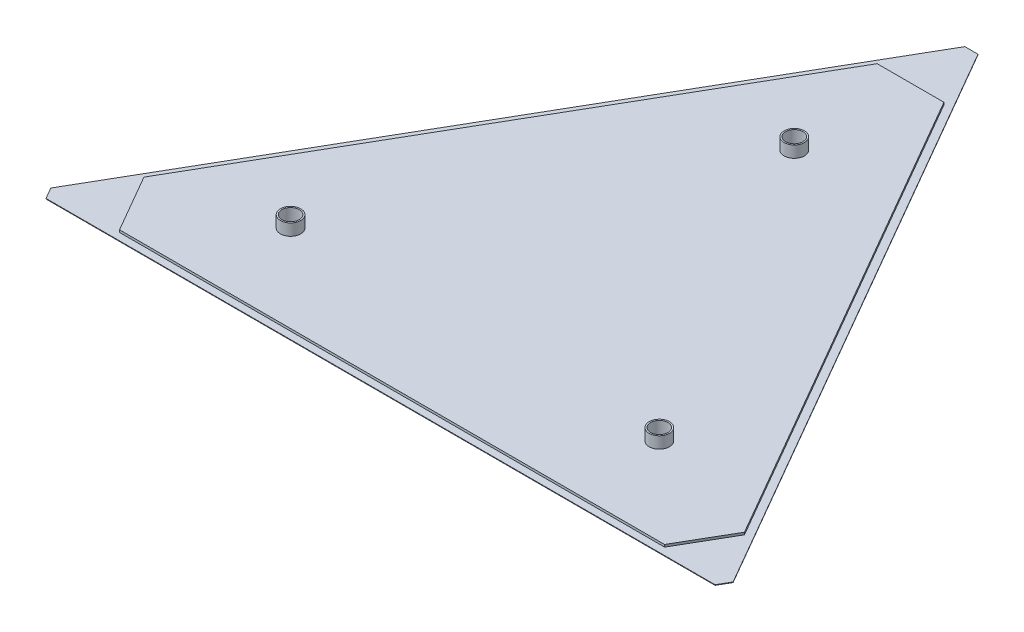
ISO-10303-21;
HEADER;
FILE_DESCRIPTION(('STEP AP214'),'2;1');
FILE_NAME('part.step','',(''),(''),'','','');
FILE_SCHEMA(('AUTOMOTIVE_DESIGN { 1 0 10303 214 1 1 1 1 }'));
ENDSEC;
DATA;
#1=APPLICATION_CONTEXT('core data for automotive mechanical design processes');
#2=APPLICATION_PROTOCOL_DEFINITION('international standard','automotive_design',2000,#1);
#3=PRODUCT_CONTEXT('',#1,'mechanical');
#4=PRODUCT('Part','Part','',(#3));
#5=PRODUCT_RELATED_PRODUCT_CATEGORY('part','',(#4));
#6=PRODUCT_DEFINITION_FORMATION('','',#4);
#7=PRODUCT_DEFINITION_CONTEXT('part definition',#1,'design');
#8=PRODUCT_DEFINITION('design','',#6,#7);
#9=PRODUCT_DEFINITION_SHAPE('','',#8);
#10=(LENGTH_UNIT() NAMED_UNIT(*) SI_UNIT(.MILLI.,.METRE.));
#11=(NAMED_UNIT(*) PLANE_ANGLE_UNIT() SI_UNIT($,.RADIAN.));
#12=(NAMED_UNIT(*) SI_UNIT($,.STERADIAN.) SOLID_ANGLE_UNIT());
#13=UNCERTAINTY_MEASURE_WITH_UNIT(LENGTH_MEASURE(1.E-05),#10,'distance_accuracy_value','');
#14=(GEOMETRIC_REPRESENTATION_CONTEXT(3) GLOBAL_UNCERTAINTY_ASSIGNED_CONTEXT((#13)) GLOBAL_UNIT_ASSIGNED_CONTEXT((#10,
#11,#12)) REPRESENTATION_CONTEXT('',''));
#15=CARTESIAN_POINT('',(0.,0.,0.));
#16=DIRECTION('',(0.,0.,1.));
#17=DIRECTION('',(1.,0.,0.));
#18=AXIS2_PLACEMENT_3D('',#15,#16,#17);
#19=CARTESIAN_POINT('',(283.758521159064,0.2,106.426112565137));
#20=DIRECTION('',(0.,1.,0.));
#21=DIRECTION('',(0.,0.,1.));
#22=AXIS2_PLACEMENT_3D('',#19,#20,#21);
#23=PLANE('',#22);
#24=CARTESIAN_POINT('',(283.758521159064,0.2,106.426112565137));
#25=DIRECTION('',(0.,1.,0.));
#26=DIRECTION('',(0.,0.,1.));
#27=AXIS2_PLACEMENT_3D('',#24,#25,#26);
#28=CIRCLE('',#27,2.99999999999999);
#29=CARTESIAN_POINT('',(283.758521159064,0.2,109.426112565137));
#30=VERTEX_POINT('',#29);
#31=EDGE_CURVE('E536',#30,#30,#28,.F.);
#32=ORIENTED_EDGE('',*,*,#31,.F.);
#33=EDGE_LOOP('',(#32));
#34=FACE_BOUND('',#33,.T.);
#35=CARTESIAN_POINT('',(283.758521159064,0.2,106.426112565137));
#36=DIRECTION('',(0.,1.,0.));
#37=DIRECTION('',(0.,0.,1.));
#38=AXIS2_PLACEMENT_3D('',#35,#36,#37);
#39=CIRCLE('',#38,1.50000000000002);
#40=CARTESIAN_POINT('',(283.758521159064,0.2,107.926112565137));
#41=VERTEX_POINT('',#40);
#42=EDGE_CURVE('E540',#41,#41,#39,.T.);
#43=ORIENTED_EDGE('',*,*,#42,.F.);
#44=EDGE_LOOP('',(#43));
#45=FACE_BOUND('',#44,.T.);
#46=ADVANCED_FACE('F340',(#34,#45),#23,.T.);
#47=CARTESIAN_POINT('',(283.758521159064,0.,106.426112565137));
#48=DIRECTION('',(0.,1.,0.));
#49=DIRECTION('',(0.,0.,1.));
#50=AXIS2_PLACEMENT_3D('',#47,#48,#49);
#51=PLANE('',#50);
#52=CARTESIAN_POINT('',(283.758521159064,0.,106.426112565137));
#53=DIRECTION('',(0.,1.,0.));
#54=DIRECTION('',(0.,0.,1.));
#55=AXIS2_PLACEMENT_3D('',#52,#53,#54);
#56=CIRCLE('',#55,1.50000000000002);
#57=CARTESIAN_POINT('',(283.758521159064,0.,107.926112565137));
#58=VERTEX_POINT('',#57);
#59=EDGE_CURVE('E539',#58,#58,#56,.T.);
#60=ORIENTED_EDGE('',*,*,#59,.T.);
#61=EDGE_LOOP('',(#60));
#62=FACE_BOUND('',#61,.T.);
#63=DIRECTION('',(-0.500006074239499,0.,0.866021896792226));
#64=VECTOR('',#63,1.);
#65=CARTESIAN_POINT('',(464.784783451273,0.,134.98666154419));
#66=LINE('',#65,#64);
#67=CARTESIAN_POINT('',(464.784783451273,0.,134.98666154419));
#68=VERTEX_POINT('',#67);
#69=CARTESIAN_POINT('',(462.517056766971,0.,138.914415757042));
#70=VERTEX_POINT('',#69);
#71=EDGE_CURVE('E503',#68,#70,#66,.T.);
#72=ORIENTED_EDGE('',*,*,#71,.T.);
#73=DIRECTION('',(-1.,0.,0.));
#74=VECTOR('',#73,1.);
#75=CARTESIAN_POINT('',(462.517056766971,0.,138.914415757042));
#76=LINE('',#75,#74);
#77=CARTESIAN_POINT('',(231.98117121446,0.,138.914415757042));
#78=VERTEX_POINT('',#77);
#79=EDGE_CURVE('E500',#70,#78,#76,.T.);
#80=ORIENTED_EDGE('',*,*,#79,.T.);
#81=DIRECTION('',(-0.500096078867163,0.,-0.865969925518022));
#82=VECTOR('',#81,1.);
#83=CARTESIAN_POINT('',(231.98117121446,0.,138.914415757042));
#84=LINE('',#83,#82);
#85=CARTESIAN_POINT('',(229.712705006684,0.,134.986323544367));
#86=VERTEX_POINT('',#85);
#87=EDGE_CURVE('E497',#78,#86,#84,.T.);
#88=ORIENTED_EDGE('',*,*,#87,.T.);
#89=DIRECTION('',(-0.500000615401474,0.,0.86602504848194));
#90=VECTOR('',#89,1.);
#91=CARTESIAN_POINT('',(344.980692968777,0.,-64.6633604527868));
#92=LINE('',#91,#90);
#93=CARTESIAN_POINT('',(344.980692968777,0.,-64.6633604527868));
#94=VERTEX_POINT('',#93);
#95=EDGE_CURVE('E494',#94,#86,#92,.T.);
#96=ORIENTED_EDGE('',*,*,#95,.F.);
#97=DIRECTION('',(-1.,0.,0.));
#98=VECTOR('',#97,1.);
#99=CARTESIAN_POINT('',(349.516789507603,0.,-64.6633604527868));
#100=LINE('',#99,#98);
#101=CARTESIAN_POINT('',(349.516789507603,0.,-64.6633604527868));
#102=VERTEX_POINT('',#101);
#103=EDGE_CURVE('E491',#102,#94,#100,.T.);
#104=ORIENTED_EDGE('',*,*,#103,.F.);
#105=DIRECTION('',(-0.500000000000002,0.,-0.866025403784437));
#106=VECTOR('',#105,1.);
#107=CARTESIAN_POINT('',(464.784783451273,0.,134.98666154419));
#108=LINE('',#107,#106);
#109=EDGE_CURVE('E489',#68,#102,#108,.T.);
#110=ORIENTED_EDGE('',*,*,#109,.F.);
#111=EDGE_LOOP('',(#72,#80,#88,#96,#104,#110));
#112=FACE_BOUND('',#111,.T.);
#113=CARTESIAN_POINT('',(410.793152562545,0.,106.417182486529));
#114=DIRECTION('',(0.,1.,0.));
#115=DIRECTION('',(0.,0.,1.));
#116=AXIS2_PLACEMENT_3D('',#113,#114,#115);
#117=CIRCLE('',#116,1.50000000000002);
#118=CARTESIAN_POINT('',(410.793152562545,0.,107.917182486529));
#119=VERTEX_POINT('',#118);
#120=EDGE_CURVE('E560',#119,#119,#117,.T.);
#121=ORIENTED_EDGE('',*,*,#120,.T.);
#122=EDGE_LOOP('',(#121));
#123=FACE_BOUND('',#122,.T.);
#124=CARTESIAN_POINT('',(347.27360972876,0.,-3.60923082455256));
#125=DIRECTION('',(0.,1.,0.));
#126=DIRECTION('',(0.,0.,1.));
#127=AXIS2_PLACEMENT_3D('',#124,#125,#126);
#128=CIRCLE('',#127,1.50000000000002);
#129=CARTESIAN_POINT('',(347.27360972876,0.,-2.10923082455254));
#130=VERTEX_POINT('',#129);
#131=EDGE_CURVE('E901',#130,#130,#128,.T.);
#132=ORIENTED_EDGE('',*,*,#131,.T.);
#133=EDGE_LOOP('',(#132));
#134=FACE_BOUND('',#133,.T.);
#135=ADVANCED_FACE('F342',(#62,#112,#123,#134),#51,.F.);
#136=CARTESIAN_POINT('',(283.758521159064,0.2,106.426112565137));
#137=DIRECTION('',(0.,-1.,0.));
#138=DIRECTION('',(0.,0.,-1.));
#139=AXIS2_PLACEMENT_3D('',#136,#137,#138);
#140=CYLINDRICAL_SURFACE('',#139,1.50000000000002);
#141=ORIENTED_EDGE('',*,*,#42,.T.);
#142=EDGE_LOOP('',(#141));
#143=FACE_BOUND('',#142,.T.);
#144=ORIENTED_EDGE('',*,*,#59,.F.);
#145=EDGE_LOOP('',(#144));
#146=FACE_BOUND('',#145,.T.);
#147=ADVANCED_FACE('F598',(#143,#146),#140,.F.);
#148=CARTESIAN_POINT('',(283.758521159064,5.,106.426112565137));
#149=DIRECTION('',(0.,-1.,0.));
#150=DIRECTION('',(0.,0.,-1.));
#151=AXIS2_PLACEMENT_3D('',#148,#149,#150);
#152=CYLINDRICAL_SURFACE('',#151,2.99999999999999);
#153=ORIENTED_EDGE('',*,*,#31,.T.);
#154=EDGE_LOOP('',(#153));
#155=FACE_BOUND('',#154,.T.);
#156=CARTESIAN_POINT('',(283.758521159064,5.,106.426112565137));
#157=DIRECTION('',(0.,1.,0.));
#158=DIRECTION('',(0.,0.,1.));
#159=AXIS2_PLACEMENT_3D('',#156,#157,#158);
#160=CIRCLE('',#159,2.99999999999999);
#161=CARTESIAN_POINT('',(283.758521159064,5.,109.426112565137));
#162=VERTEX_POINT('',#161);
#163=EDGE_CURVE('E530',#162,#162,#160,.T.);
#164=ORIENTED_EDGE('',*,*,#163,.T.);
#165=EDGE_LOOP('',(#164));
#166=FACE_BOUND('',#165,.T.);
#167=ADVANCED_FACE('F605',(#155,#166),#152,.F.);
#168=CARTESIAN_POINT('',(283.758521159064,5.,106.426112565137));
#169=DIRECTION('',(0.,-1.,0.));
#170=DIRECTION('',(0.,0.,-1.));
#171=AXIS2_PLACEMENT_3D('',#168,#169,#170);
#172=CYLINDRICAL_SURFACE('',#171,3.50000000000002);
#173=CARTESIAN_POINT('',(283.758521159064,1.,106.426112565137));
#174=DIRECTION('',(0.,1.,0.));
#175=DIRECTION('',(0.,0.,1.));
#176=AXIS2_PLACEMENT_3D('',#173,#174,#175);
#177=CIRCLE('',#176,3.50000000000002);
#178=CARTESIAN_POINT('',(283.758521159064,1.,109.926112565137));
#179=VERTEX_POINT('',#178);
#180=EDGE_CURVE('E563',#179,#179,#177,.T.);
#181=ORIENTED_EDGE('',*,*,#180,.T.);
#182=EDGE_LOOP('',(#181));
#183=FACE_BOUND('',#182,.T.);
#184=CARTESIAN_POINT('',(283.758521159064,5.,106.426112565137));
#185=DIRECTION('',(0.,1.,0.));
#186=DIRECTION('',(0.,0.,1.));
#187=AXIS2_PLACEMENT_3D('',#184,#185,#186);
#188=CIRCLE('',#187,3.50000000000002);
#189=CARTESIAN_POINT('',(283.758521159064,5.,109.926112565137));
#190=VERTEX_POINT('',#189);
#191=EDGE_CURVE('E533',#190,#190,#188,.T.);
#192=ORIENTED_EDGE('',*,*,#191,.F.);
#193=EDGE_LOOP('',(#192));
#194=FACE_BOUND('',#193,.T.);
#195=ADVANCED_FACE('F609',(#183,#194),#172,.T.);
#196=CARTESIAN_POINT('',(0.,5.,0.));
#197=DIRECTION('',(0.,1.,0.));
#198=DIRECTION('',(0.,0.,1.));
#199=AXIS2_PLACEMENT_3D('',#196,#197,#198);
#200=PLANE('',#199);
#201=ORIENTED_EDGE('',*,*,#163,.F.);
#202=EDGE_LOOP('',(#201));
#203=FACE_BOUND('',#202,.T.);
#204=ORIENTED_EDGE('',*,*,#191,.T.);
#205=EDGE_LOOP('',(#204));
#206=FACE_BOUND('',#205,.T.);
#207=ADVANCED_FACE('F613',(#203,#206),#200,.T.);
#208=CARTESIAN_POINT('',(0.,0.2,0.));
#209=DIRECTION('',(0.,-1.,0.));
#210=DIRECTION('',(0.,0.,-1.));
#211=AXIS2_PLACEMENT_3D('',#208,#209,#210);
#212=PLANE('',#211);
#213=DIRECTION('',(-0.500006074239499,0.,0.866021896792226));
#214=VECTOR('',#213,1.);
#215=CARTESIAN_POINT('',(464.784783451273,0.2,134.98666154419));
#216=LINE('',#215,#214);
#217=CARTESIAN_POINT('',(464.784783451273,0.2,134.98666154419));
#218=VERTEX_POINT('',#217);
#219=CARTESIAN_POINT('',(462.517056766971,0.2,138.914415757042));
#220=VERTEX_POINT('',#219);
#221=EDGE_CURVE('E492',#218,#220,#216,.T.);
#222=ORIENTED_EDGE('',*,*,#221,.F.);
#223=DIRECTION('',(-0.500000000000002,0.,-0.866025403784437));
#224=VECTOR('',#223,1.);
#225=CARTESIAN_POINT('',(464.784783451273,0.2,134.98666154419));
#226=LINE('',#225,#224);
#227=CARTESIAN_POINT('',(349.516789507603,0.2,-64.6633604527868));
#228=VERTEX_POINT('',#227);
#229=EDGE_CURVE('E477',#218,#228,#226,.T.);
#230=ORIENTED_EDGE('',*,*,#229,.T.);
#231=DIRECTION('',(-1.,0.,0.));
#232=VECTOR('',#231,1.);
#233=CARTESIAN_POINT('',(349.516789507603,0.2,-64.6633604527868));
#234=LINE('',#233,#232);
#235=CARTESIAN_POINT('',(344.980692968777,0.2,-64.6633604527868));
#236=VERTEX_POINT('',#235);
#237=EDGE_CURVE('E508',#228,#236,#234,.T.);
#238=ORIENTED_EDGE('',*,*,#237,.T.);
#239=DIRECTION('',(-0.500000615401474,0.,0.86602504848194));
#240=VECTOR('',#239,1.);
#241=CARTESIAN_POINT('',(344.980692968777,0.2,-64.6633604527868));
#242=LINE('',#241,#240);
#243=CARTESIAN_POINT('',(229.712705006684,0.2,134.986323544367));
#244=VERTEX_POINT('',#243);
#245=EDGE_CURVE('E510',#236,#244,#242,.T.);
#246=ORIENTED_EDGE('',*,*,#245,.T.);
#247=DIRECTION('',(-0.500096078867163,0.,-0.865969925518022));
#248=VECTOR('',#247,1.);
#249=CARTESIAN_POINT('',(231.98117121446,0.2,138.914415757042));
#250=LINE('',#249,#248);
#251=CARTESIAN_POINT('',(231.98117121446,0.2,138.914415757042));
#252=VERTEX_POINT('',#251);
#253=EDGE_CURVE('E512',#252,#244,#250,.T.);
#254=ORIENTED_EDGE('',*,*,#253,.F.);
#255=DIRECTION('',(-1.,0.,0.));
#256=VECTOR('',#255,1.);
#257=CARTESIAN_POINT('',(462.517056766971,0.2,138.914415757042));
#258=LINE('',#257,#256);
#259=EDGE_CURVE('E515',#220,#252,#258,.T.);
#260=ORIENTED_EDGE('',*,*,#259,.F.);
#261=EDGE_LOOP('',(#222,#230,#238,#246,#254,#260));
#262=FACE_BOUND('',#261,.T.);
#263=DIRECTION('',(-0.500000615401474,0.,0.86602504848194));
#264=VECTOR('',#263,1.);
#265=CARTESIAN_POINT('',(335.767496284372,0.2,-43.6660380660085));
#266=LINE('',#265,#264);
#267=CARTESIAN_POINT('',(335.767496284372,0.2,-43.6660380660085));
#268=VERTEX_POINT('',#267);
#269=CARTESIAN_POINT('',(243.304219773312,0.2,116.484791866457));
#270=VERTEX_POINT('',#269);
#271=EDGE_CURVE('E528',#268,#270,#266,.T.);
#272=ORIENTED_EDGE('',*,*,#271,.F.);
#273=DIRECTION('',(-1.,0.,0.));
#274=VECTOR('',#273,1.);
#275=CARTESIAN_POINT('',(358.778179034986,0.2,-43.6660380660085));
#276=LINE('',#275,#274);
#277=CARTESIAN_POINT('',(358.778179034986,0.2,-43.6660380660085));
#278=VERTEX_POINT('',#277);
#279=EDGE_CURVE('E506',#278,#268,#276,.T.);
#280=ORIENTED_EDGE('',*,*,#279,.F.);
#281=DIRECTION('',(-0.500061082747631,0.,-0.86599013477133));
#282=VECTOR('',#281,1.);
#283=CARTESIAN_POINT('',(452.699916625105,0.2,118.984688014734));
#284=LINE('',#283,#282);
#285=CARTESIAN_POINT('',(452.699916625105,0.2,118.984688014734));
#286=VERTEX_POINT('',#285);
#287=EDGE_CURVE('E522',#286,#278,#284,.T.);
#288=ORIENTED_EDGE('',*,*,#287,.F.);
#289=DIRECTION('',(-0.501404010499261,0.,0.865213279056244));
#290=VECTOR('',#289,1.);
#291=CARTESIAN_POINT('',(452.699916625105,0.2,118.984688014734));
#292=LINE('',#291,#290);
#293=CARTESIAN_POINT('',(442.602090749265,0.2,136.40930539798));
#294=VERTEX_POINT('',#293);
#295=EDGE_CURVE('E361',#286,#294,#292,.T.);
#296=ORIENTED_EDGE('',*,*,#295,.T.);
#297=DIRECTION('',(-0.999999999997625,0.,-2.17931289567932E-06));
#298=VECTOR('',#297,1.);
#299=CARTESIAN_POINT('',(442.602090749265,0.2,136.40930539798));
#300=LINE('',#299,#298);
#301=CARTESIAN_POINT('',(254.809280576088,0.2,136.408896138687));
#302=VERTEX_POINT('',#301);
#303=EDGE_CURVE('E433',#294,#302,#300,.T.);
#304=ORIENTED_EDGE('',*,*,#303,.T.);
#305=DIRECTION('',(0.500061082747631,0.,0.86599013477133));
#306=VECTOR('',#305,1.);
#307=CARTESIAN_POINT('',(243.304219773312,0.2,116.484791866457));
#308=LINE('',#307,#306);
#309=EDGE_CURVE('E355',#270,#302,#308,.T.);
#310=ORIENTED_EDGE('',*,*,#309,.F.);
#311=EDGE_LOOP('',(#272,#280,#288,#296,#304,#310));
#312=FACE_BOUND('',#311,.T.);
#313=ADVANCED_FACE('F617',(#262,#312),#212,.F.);
#314=CARTESIAN_POINT('',(464.784783451273,0.2,134.98666154419));
#315=DIRECTION('',(0.866021896792226,0.,0.500006074239499));
#316=DIRECTION('',(0.500006074239499,0.,-0.866021896792226));
#317=AXIS2_PLACEMENT_3D('',#314,#315,#316);
#318=PLANE('',#317);
#319=ORIENTED_EDGE('',*,*,#71,.F.);
#320=DIRECTION('',(0.,-1.,0.));
#321=VECTOR('',#320,1.);
#322=CARTESIAN_POINT('',(464.784783451273,0.2,134.98666154419));
#323=LINE('',#322,#321);
#324=EDGE_CURVE('E436',#218,#68,#323,.T.);
#325=ORIENTED_EDGE('',*,*,#324,.F.);
#326=ORIENTED_EDGE('',*,*,#221,.T.);
#327=DIRECTION('',(0.,-1.,0.));
#328=VECTOR('',#327,1.);
#329=CARTESIAN_POINT('',(462.517056766971,0.2,138.914415757042));
#330=LINE('',#329,#328);
#331=EDGE_CURVE('E475',#220,#70,#330,.T.);
#332=ORIENTED_EDGE('',*,*,#331,.T.);
#333=EDGE_LOOP('',(#319,#325,#326,#332));
#334=FACE_BOUND('',#333,.T.);
#335=ADVANCED_FACE('F621',(#334),#318,.T.);
#336=CARTESIAN_POINT('',(464.784783451273,0.2,134.98666154419));
#337=DIRECTION('',(-0.866025403784438,0.,0.500000000000002));
#338=DIRECTION('',(0.500000000000002,0.,0.866025403784438));
#339=AXIS2_PLACEMENT_3D('',#336,#337,#338);
#340=PLANE('',#339);
#341=ORIENTED_EDGE('',*,*,#109,.T.);
#342=DIRECTION('',(0.,-1.,0.));
#343=VECTOR('',#342,1.);
#344=CARTESIAN_POINT('',(349.516789507603,0.2,-64.6633604527868));
#345=LINE('',#344,#343);
#346=EDGE_CURVE('E485',#228,#102,#345,.T.);
#347=ORIENTED_EDGE('',*,*,#346,.F.);
#348=ORIENTED_EDGE('',*,*,#229,.F.);
#349=ORIENTED_EDGE('',*,*,#324,.T.);
#350=EDGE_LOOP('',(#341,#347,#348,#349));
#351=FACE_BOUND('',#350,.T.);
#352=ADVANCED_FACE('F623',(#351),#340,.F.);
#353=CARTESIAN_POINT('',(349.516789507603,0.2,-64.6633604527868));
#354=DIRECTION('',(0.,0.,1.));
#355=DIRECTION('',(1.,0.,0.));
#356=AXIS2_PLACEMENT_3D('',#353,#354,#355);
#357=PLANE('',#356);
#358=ORIENTED_EDGE('',*,*,#103,.T.);
#359=DIRECTION('',(0.,-1.,0.));
#360=VECTOR('',#359,1.);
#361=CARTESIAN_POINT('',(344.980692968777,0.2,-64.6633604527868));
#362=LINE('',#361,#360);
#363=EDGE_CURVE('E482',#236,#94,#362,.T.);
#364=ORIENTED_EDGE('',*,*,#363,.F.);
#365=ORIENTED_EDGE('',*,*,#237,.F.);
#366=ORIENTED_EDGE('',*,*,#346,.T.);
#367=EDGE_LOOP('',(#358,#364,#365,#366));
#368=FACE_BOUND('',#367,.T.);
#369=ADVANCED_FACE('F626',(#368),#357,.F.);
#370=CARTESIAN_POINT('',(344.980692968777,0.2,-64.6633604527868));
#371=DIRECTION('',(0.866025048481941,0.,0.500000615401474));
#372=DIRECTION('',(0.500000615401474,0.,-0.866025048481941));
#373=AXIS2_PLACEMENT_3D('',#370,#371,#372);
#374=PLANE('',#373);
#375=ORIENTED_EDGE('',*,*,#95,.T.);
#376=DIRECTION('',(0.,-1.,0.));
#377=VECTOR('',#376,1.);
#378=CARTESIAN_POINT('',(229.712705006684,0.2,134.986323544367));
#379=LINE('',#378,#377);
#380=EDGE_CURVE('E480',#244,#86,#379,.T.);
#381=ORIENTED_EDGE('',*,*,#380,.F.);
#382=ORIENTED_EDGE('',*,*,#245,.F.);
#383=ORIENTED_EDGE('',*,*,#363,.T.);
#384=EDGE_LOOP('',(#375,#381,#382,#383));
#385=FACE_BOUND('',#384,.T.);
#386=ADVANCED_FACE('F630',(#385),#374,.F.);
#387=CARTESIAN_POINT('',(231.98117121446,0.2,138.914415757042));
#388=DIRECTION('',(-0.865969925518022,0.,0.500096078867163));
#389=DIRECTION('',(0.500096078867163,0.,0.865969925518022));
#390=AXIS2_PLACEMENT_3D('',#387,#388,#389);
#391=PLANE('',#390);
#392=ORIENTED_EDGE('',*,*,#87,.F.);
#393=DIRECTION('',(0.,-1.,0.));
#394=VECTOR('',#393,1.);
#395=CARTESIAN_POINT('',(231.98117121446,0.2,138.914415757042));
#396=LINE('',#395,#394);
#397=EDGE_CURVE('E478',#252,#78,#396,.T.);
#398=ORIENTED_EDGE('',*,*,#397,.F.);
#399=ORIENTED_EDGE('',*,*,#253,.T.);
#400=ORIENTED_EDGE('',*,*,#380,.T.);
#401=EDGE_LOOP('',(#392,#398,#399,#400));
#402=FACE_BOUND('',#401,.T.);
#403=ADVANCED_FACE('F634',(#402),#391,.T.);
#404=CARTESIAN_POINT('',(462.517056766971,0.2,138.914415757042));
#405=DIRECTION('',(0.,0.,1.));
#406=DIRECTION('',(1.,0.,0.));
#407=AXIS2_PLACEMENT_3D('',#404,#405,#406);
#408=PLANE('',#407);
#409=ORIENTED_EDGE('',*,*,#79,.F.);
#410=ORIENTED_EDGE('',*,*,#331,.F.);
#411=ORIENTED_EDGE('',*,*,#259,.T.);
#412=ORIENTED_EDGE('',*,*,#397,.T.);
#413=EDGE_LOOP('',(#409,#410,#411,#412));
#414=FACE_BOUND('',#413,.T.);
#415=ADVANCED_FACE('F638',(#414),#408,.T.);
#416=CARTESIAN_POINT('',(132.019800225658,1.,-76.2340835007328));
#417=DIRECTION('',(0.86599013477133,0.,-0.500061082747631));
#418=DIRECTION('',(-0.500061082747631,0.,-0.86599013477133));
#419=AXIS2_PLACEMENT_3D('',#416,#417,#418);
#420=PLANE('',#419);
#421=DIRECTION('',(0.,-1.,0.));
#422=VECTOR('',#421,1.);
#423=CARTESIAN_POINT('',(243.304219773312,1.,116.484791866457));
#424=LINE('',#423,#422);
#425=CARTESIAN_POINT('',(243.304219773312,1.,116.484791866457));
#426=VERTEX_POINT('',#425);
#427=EDGE_CURVE('E465',#426,#270,#424,.T.);
#428=ORIENTED_EDGE('',*,*,#427,.T.);
#429=ORIENTED_EDGE('',*,*,#309,.T.);
#430=DIRECTION('',(0.,-1.,0.));
#431=VECTOR('',#430,1.);
#432=CARTESIAN_POINT('',(254.809280576088,1.,136.408896138687));
#433=LINE('',#432,#431);
#434=CARTESIAN_POINT('',(254.809280576088,1.,136.408896138687));
#435=VERTEX_POINT('',#434);
#436=EDGE_CURVE('E463',#435,#302,#433,.T.);
#437=ORIENTED_EDGE('',*,*,#436,.F.);
#438=DIRECTION('',(0.500061082747631,0.,0.86599013477133));
#439=VECTOR('',#438,1.);
#440=CARTESIAN_POINT('',(132.019800225658,1.,-76.2340835007328));
#441=LINE('',#440,#439);
#442=EDGE_CURVE('E445',#426,#435,#441,.T.);
#443=ORIENTED_EDGE('',*,*,#442,.F.);
#444=EDGE_LOOP('',(#428,#429,#437,#443));
#445=FACE_BOUND('',#444,.T.);
#446=ADVANCED_FACE('F642',(#445),#420,.F.);
#447=CARTESIAN_POINT('',(-0.000297276456247321,1.,136.408340828888));
#448=DIRECTION('',(-2.17931289567932E-06,0.,0.999999999997625));
#449=DIRECTION('',(0.999999999997625,0.,2.17931289567932E-06));
#450=AXIS2_PLACEMENT_3D('',#447,#448,#449);
#451=PLANE('',#450);
#452=ORIENTED_EDGE('',*,*,#303,.F.);
#453=DIRECTION('',(0.,-1.,0.));
#454=VECTOR('',#453,1.);
#455=CARTESIAN_POINT('',(442.602090749265,1.,136.40930539798));
#456=LINE('',#455,#454);
#457=CARTESIAN_POINT('',(442.602090749265,1.,136.40930539798));
#458=VERTEX_POINT('',#457);
#459=EDGE_CURVE('E428',#458,#294,#456,.T.);
#460=ORIENTED_EDGE('',*,*,#459,.F.);
#461=DIRECTION('',(-0.999999999997625,0.,-2.17931289567932E-06));
#462=VECTOR('',#461,1.);
#463=CARTESIAN_POINT('',(-0.000297276456247321,1.,136.408340828888));
#464=LINE('',#463,#462);
#465=EDGE_CURVE('E432',#458,#435,#464,.T.);
#466=ORIENTED_EDGE('',*,*,#465,.T.);
#467=ORIENTED_EDGE('',*,*,#436,.T.);
#468=EDGE_LOOP('',(#452,#460,#466,#467));
#469=FACE_BOUND('',#468,.T.);
#470=ADVANCED_FACE('F430',(#469),#451,.T.);
#471=CARTESIAN_POINT('',(390.506554541865,1.,226.30437756008));
#472=DIRECTION('',(0.865213279056244,0.,0.501404010499261));
#473=DIRECTION('',(0.501404010499261,0.,-0.865213279056244));
#474=AXIS2_PLACEMENT_3D('',#471,#472,#473);
#475=PLANE('',#474);
#476=ORIENTED_EDGE('',*,*,#295,.F.);
#477=DIRECTION('',(0.,-1.,0.));
#478=VECTOR('',#477,1.);
#479=CARTESIAN_POINT('',(452.699916625105,1.,118.984688014734));
#480=LINE('',#479,#478);
#481=CARTESIAN_POINT('',(452.699916625105,1.,118.984688014734));
#482=VERTEX_POINT('',#481);
#483=EDGE_CURVE('E437',#482,#286,#480,.T.);
#484=ORIENTED_EDGE('',*,*,#483,.F.);
#485=DIRECTION('',(-0.501404010499261,0.,0.865213279056244));
#486=VECTOR('',#485,1.);
#487=CARTESIAN_POINT('',(390.506554541865,1.,226.30437756008));
#488=LINE('',#487,#486);
#489=EDGE_CURVE('E443',#482,#458,#488,.T.);
#490=ORIENTED_EDGE('',*,*,#489,.T.);
#491=ORIENTED_EDGE('',*,*,#459,.T.);
#492=EDGE_LOOP('',(#476,#484,#490,#491));
#493=FACE_BOUND('',#492,.T.);
#494=ADVANCED_FACE('F449',(#493),#475,.T.);
#495=CARTESIAN_POINT('',(0.,1.,-43.6660380660085));
#496=DIRECTION('',(0.,0.,1.));
#497=DIRECTION('',(1.,0.,0.));
#498=AXIS2_PLACEMENT_3D('',#495,#496,#497);
#499=PLANE('',#498);
#500=DIRECTION('',(0.,-1.,0.));
#501=VECTOR('',#500,1.);
#502=CARTESIAN_POINT('',(358.778179034986,1.,-43.6660380660085));
#503=LINE('',#502,#501);
#504=CARTESIAN_POINT('',(358.778179034986,1.,-43.6660380660085));
#505=VERTEX_POINT('',#504);
#506=EDGE_CURVE('E471',#505,#278,#503,.T.);
#507=ORIENTED_EDGE('',*,*,#506,.T.);
#508=ORIENTED_EDGE('',*,*,#279,.T.);
#509=DIRECTION('',(0.,-1.,0.));
#510=VECTOR('',#509,1.);
#511=CARTESIAN_POINT('',(335.767496284372,1.,-43.6660380660085));
#512=LINE('',#511,#510);
#513=CARTESIAN_POINT('',(335.767496284372,1.,-43.6660380660085));
#514=VERTEX_POINT('',#513);
#515=EDGE_CURVE('E468',#514,#268,#512,.T.);
#516=ORIENTED_EDGE('',*,*,#515,.F.);
#517=DIRECTION('',(-1.,0.,0.));
#518=VECTOR('',#517,1.);
#519=CARTESIAN_POINT('',(0.,1.,-43.6660380660085));
#520=LINE('',#519,#518);
#521=EDGE_CURVE('E454',#505,#514,#520,.T.);
#522=ORIENTED_EDGE('',*,*,#521,.F.);
#523=EDGE_LOOP('',(#507,#508,#516,#522));
#524=FACE_BOUND('',#523,.T.);
#525=ADVANCED_FACE('F651',(#524),#499,.F.);
#526=CARTESIAN_POINT('',(287.97120668039,1.,-166.287337038502));
#527=DIRECTION('',(-0.86599013477133,0.,0.500061082747631));
#528=DIRECTION('',(0.500061082747631,0.,0.86599013477133));
#529=AXIS2_PLACEMENT_3D('',#526,#527,#528);
#530=PLANE('',#529);
#531=ORIENTED_EDGE('',*,*,#483,.T.);
#532=ORIENTED_EDGE('',*,*,#287,.T.);
#533=ORIENTED_EDGE('',*,*,#506,.F.);
#534=DIRECTION('',(-0.500061082747631,0.,-0.86599013477133));
#535=VECTOR('',#534,1.);
#536=CARTESIAN_POINT('',(287.97120668039,1.,-166.287337038502));
#537=LINE('',#536,#535);
#538=EDGE_CURVE('E452',#482,#505,#537,.T.);
#539=ORIENTED_EDGE('',*,*,#538,.F.);
#540=EDGE_LOOP('',(#531,#532,#533,#539));
#541=FACE_BOUND('',#540,.T.);
#542=ADVANCED_FACE('F587',(#541),#530,.F.);
#543=CARTESIAN_POINT('',(232.917450942825,1.,134.475173683829));
#544=DIRECTION('',(0.866025048481941,0.,0.500000615401474));
#545=DIRECTION('',(0.500000615401474,0.,-0.866025048481941));
#546=AXIS2_PLACEMENT_3D('',#543,#544,#545);
#547=PLANE('',#546);
#548=ORIENTED_EDGE('',*,*,#515,.T.);
#549=ORIENTED_EDGE('',*,*,#271,.T.);
#550=ORIENTED_EDGE('',*,*,#427,.F.);
#551=DIRECTION('',(-0.500000615401474,0.,0.866025048481941));
#552=VECTOR('',#551,1.);
#553=CARTESIAN_POINT('',(232.917450942825,1.,134.475173683829));
#554=LINE('',#553,#552);
#555=EDGE_CURVE('E460',#514,#426,#554,.T.);
#556=ORIENTED_EDGE('',*,*,#555,.F.);
#557=EDGE_LOOP('',(#548,#549,#550,#556));
#558=FACE_BOUND('',#557,.T.);
#559=ADVANCED_FACE('F581',(#558),#547,.F.);
#560=CARTESIAN_POINT('',(0.,1.,0.));
#561=DIRECTION('',(0.,1.,0.));
#562=DIRECTION('',(0.,0.,1.));
#563=AXIS2_PLACEMENT_3D('',#560,#561,#562);
#564=PLANE('',#563);
#565=ORIENTED_EDGE('',*,*,#180,.F.);
#566=EDGE_LOOP('',(#565));
#567=FACE_BOUND('',#566,.T.);
#568=CARTESIAN_POINT('',(410.793152562545,1.,106.417182486529));
#569=DIRECTION('',(0.,1.,0.));
#570=DIRECTION('',(0.,0.,1.));
#571=AXIS2_PLACEMENT_3D('',#568,#569,#570);
#572=CIRCLE('',#571,3.50000000000002);
#573=CARTESIAN_POINT('',(410.793152562545,1.,109.917182486529));
#574=VERTEX_POINT('',#573);
#575=EDGE_CURVE('E572',#574,#574,#572,.T.);
#576=ORIENTED_EDGE('',*,*,#575,.F.);
#577=EDGE_LOOP('',(#576));
#578=FACE_BOUND('',#577,.T.);
#579=CARTESIAN_POINT('',(347.27360972876,1.,-3.60923082455256));
#580=DIRECTION('',(0.,1.,0.));
#581=DIRECTION('',(0.,0.,1.));
#582=AXIS2_PLACEMENT_3D('',#579,#580,#581);
#583=CIRCLE('',#582,3.50000000000002);
#584=CARTESIAN_POINT('',(347.27360972876,1.,-0.10923082455254));
#585=VERTEX_POINT('',#584);
#586=EDGE_CURVE('E447',#585,#585,#583,.T.);
#587=ORIENTED_EDGE('',*,*,#586,.F.);
#588=EDGE_LOOP('',(#587));
#589=FACE_BOUND('',#588,.T.);
#590=ORIENTED_EDGE('',*,*,#465,.F.);
#591=ORIENTED_EDGE('',*,*,#489,.F.);
#592=ORIENTED_EDGE('',*,*,#538,.T.);
#593=ORIENTED_EDGE('',*,*,#521,.T.);
#594=ORIENTED_EDGE('',*,*,#555,.T.);
#595=ORIENTED_EDGE('',*,*,#442,.T.);
#596=EDGE_LOOP('',(#590,#591,#592,#593,#594,#595));
#597=FACE_BOUND('',#596,.T.);
#598=ADVANCED_FACE('F441',(#567,#578,#589,#597),#564,.T.);
#599=CARTESIAN_POINT('',(410.793152562545,5.,106.417182486529));
#600=DIRECTION('',(0.,-1.,0.));
#601=DIRECTION('',(0.,0.,-1.));
#602=AXIS2_PLACEMENT_3D('',#599,#600,#601);
#603=CYLINDRICAL_SURFACE('',#602,2.99999999999999);
#604=CARTESIAN_POINT('',(410.793152562545,0.2,106.417182486529));
#605=DIRECTION('',(0.,1.,0.));
#606=DIRECTION('',(0.,0.,1.));
#607=AXIS2_PLACEMENT_3D('',#604,#605,#606);
#608=CIRCLE('',#607,2.99999999999999);
#609=CARTESIAN_POINT('',(410.793152562545,0.2,109.417182486529));
#610=VERTEX_POINT('',#609);
#611=EDGE_CURVE('E348',#610,#610,#608,.T.);
#612=ORIENTED_EDGE('',*,*,#611,.F.);
#613=EDGE_LOOP('',(#612));
#614=FACE_BOUND('',#613,.T.);
#615=CARTESIAN_POINT('',(410.793152562545,5.,106.417182486529));
#616=DIRECTION('',(0.,1.,0.));
#617=DIRECTION('',(0.,0.,1.));
#618=AXIS2_PLACEMENT_3D('',#615,#616,#617);
#619=CIRCLE('',#618,2.99999999999999);
#620=CARTESIAN_POINT('',(410.793152562545,5.,109.417182486529));
#621=VERTEX_POINT('',#620);
#622=EDGE_CURVE('E557',#621,#621,#619,.T.);
#623=ORIENTED_EDGE('',*,*,#622,.T.);
#624=EDGE_LOOP('',(#623));
#625=FACE_BOUND('',#624,.T.);
#626=ADVANCED_FACE('F550',(#614,#625),#603,.F.);
#627=CARTESIAN_POINT('',(410.793152562545,5.,106.417182486529));
#628=DIRECTION('',(0.,-1.,0.));
#629=DIRECTION('',(0.,0.,-1.));
#630=AXIS2_PLACEMENT_3D('',#627,#628,#629);
#631=CYLINDRICAL_SURFACE('',#630,3.50000000000002);
#632=ORIENTED_EDGE('',*,*,#575,.T.);
#633=EDGE_LOOP('',(#632));
#634=FACE_BOUND('',#633,.T.);
#635=CARTESIAN_POINT('',(410.793152562545,5.,106.417182486529));
#636=DIRECTION('',(0.,1.,0.));
#637=DIRECTION('',(0.,0.,1.));
#638=AXIS2_PLACEMENT_3D('',#635,#636,#637);
#639=CIRCLE('',#638,3.50000000000002);
#640=CARTESIAN_POINT('',(410.793152562545,5.,109.917182486529));
#641=VERTEX_POINT('',#640);
#642=EDGE_CURVE('E559',#641,#641,#639,.T.);
#643=ORIENTED_EDGE('',*,*,#642,.F.);
#644=EDGE_LOOP('',(#643));
#645=FACE_BOUND('',#644,.T.);
#646=ADVANCED_FACE('F553',(#634,#645),#631,.T.);
#647=CARTESIAN_POINT('',(0.,5.,0.));
#648=DIRECTION('',(0.,1.,0.));
#649=DIRECTION('',(0.,0.,1.));
#650=AXIS2_PLACEMENT_3D('',#647,#648,#649);
#651=PLANE('',#650);
#652=ORIENTED_EDGE('',*,*,#622,.F.);
#653=EDGE_LOOP('',(#652));
#654=FACE_BOUND('',#653,.T.);
#655=ORIENTED_EDGE('',*,*,#642,.T.);
#656=EDGE_LOOP('',(#655));
#657=FACE_BOUND('',#656,.T.);
#658=ADVANCED_FACE('F707',(#654,#657),#651,.T.);
#659=CARTESIAN_POINT('',(410.793152562545,0.2,106.417182486529));
#660=DIRECTION('',(0.,1.,0.));
#661=DIRECTION('',(0.,0.,1.));
#662=AXIS2_PLACEMENT_3D('',#659,#660,#661);
#663=PLANE('',#662);
#664=ORIENTED_EDGE('',*,*,#611,.T.);
#665=EDGE_LOOP('',(#664));
#666=FACE_BOUND('',#665,.T.);
#667=CARTESIAN_POINT('',(410.793152562545,0.2,106.417182486529));
#668=DIRECTION('',(0.,1.,0.));
#669=DIRECTION('',(0.,0.,1.));
#670=AXIS2_PLACEMENT_3D('',#667,#668,#669);
#671=CIRCLE('',#670,1.50000000000002);
#672=CARTESIAN_POINT('',(410.793152562545,0.2,107.917182486529));
#673=VERTEX_POINT('',#672);
#674=EDGE_CURVE('E566',#673,#673,#671,.T.);
#675=ORIENTED_EDGE('',*,*,#674,.F.);
#676=EDGE_LOOP('',(#675));
#677=FACE_BOUND('',#676,.T.);
#678=ADVANCED_FACE('F547',(#666,#677),#663,.T.);
#679=CARTESIAN_POINT('',(410.793152562545,0.2,106.417182486529));
#680=DIRECTION('',(0.,-1.,0.));
#681=DIRECTION('',(0.,0.,-1.));
#682=AXIS2_PLACEMENT_3D('',#679,#680,#681);
#683=CYLINDRICAL_SURFACE('',#682,1.50000000000002);
#684=ORIENTED_EDGE('',*,*,#674,.T.);
#685=EDGE_LOOP('',(#684));
#686=FACE_BOUND('',#685,.T.);
#687=ORIENTED_EDGE('',*,*,#120,.F.);
#688=EDGE_LOOP('',(#687));
#689=FACE_BOUND('',#688,.T.);
#690=ADVANCED_FACE('F726',(#686,#689),#683,.F.);
#691=CARTESIAN_POINT('',(347.27360972876,5.,-3.60923082455256));
#692=DIRECTION('',(0.,-1.,0.));
#693=DIRECTION('',(0.,0.,-1.));
#694=AXIS2_PLACEMENT_3D('',#691,#692,#693);
#695=CYLINDRICAL_SURFACE('',#694,2.99999999999999);
#696=CARTESIAN_POINT('',(347.27360972876,0.2,-3.60923082455256));
#697=DIRECTION('',(0.,1.,0.));
#698=DIRECTION('',(0.,0.,1.));
#699=AXIS2_PLACEMENT_3D('',#696,#697,#698);
#700=CIRCLE('',#699,2.99999999999999);
#701=CARTESIAN_POINT('',(347.27360972876,0.2,-0.609230824552565));
#702=VERTEX_POINT('',#701);
#703=EDGE_CURVE('E12',#702,#702,#700,.T.);
#704=ORIENTED_EDGE('',*,*,#703,.F.);
#705=EDGE_LOOP('',(#704));
#706=FACE_BOUND('',#705,.T.);
#707=CARTESIAN_POINT('',(347.27360972876,5.,-3.60923082455256));
#708=DIRECTION('',(0.,1.,0.));
#709=DIRECTION('',(0.,0.,1.));
#710=AXIS2_PLACEMENT_3D('',#707,#708,#709);
#711=CIRCLE('',#710,2.99999999999999);
#712=CARTESIAN_POINT('',(347.27360972876,5.,-0.609230824552565));
#713=VERTEX_POINT('',#712);
#714=EDGE_CURVE('E903',#713,#713,#711,.T.);
#715=ORIENTED_EDGE('',*,*,#714,.T.);
#716=EDGE_LOOP('',(#715));
#717=FACE_BOUND('',#716,.T.);
#718=ADVANCED_FACE('F736',(#706,#717),#695,.F.);
#719=CARTESIAN_POINT('',(347.27360972876,5.,-3.60923082455256));
#720=DIRECTION('',(0.,-1.,0.));
#721=DIRECTION('',(0.,0.,-1.));
#722=AXIS2_PLACEMENT_3D('',#719,#720,#721);
#723=CYLINDRICAL_SURFACE('',#722,3.50000000000002);
#724=ORIENTED_EDGE('',*,*,#586,.T.);
#725=EDGE_LOOP('',(#724));
#726=FACE_BOUND('',#725,.T.);
#727=CARTESIAN_POINT('',(347.27360972876,5.,-3.60923082455256));
#728=DIRECTION('',(0.,1.,0.));
#729=DIRECTION('',(0.,0.,1.));
#730=AXIS2_PLACEMENT_3D('',#727,#728,#729);
#731=CIRCLE('',#730,3.50000000000002);
#732=CARTESIAN_POINT('',(347.27360972876,5.,-0.10923082455254));
#733=VERTEX_POINT('',#732);
#734=EDGE_CURVE('E906',#733,#733,#731,.T.);
#735=ORIENTED_EDGE('',*,*,#734,.F.);
#736=EDGE_LOOP('',(#735));
#737=FACE_BOUND('',#736,.T.);
#738=ADVANCED_FACE('F577',(#726,#737),#723,.T.);
#739=CARTESIAN_POINT('',(0.,5.,0.));
#740=DIRECTION('',(0.,1.,0.));
#741=DIRECTION('',(0.,0.,1.));
#742=AXIS2_PLACEMENT_3D('',#739,#740,#741);
#743=PLANE('',#742);
#744=ORIENTED_EDGE('',*,*,#714,.F.);
#745=EDGE_LOOP('',(#744));
#746=FACE_BOUND('',#745,.T.);
#747=ORIENTED_EDGE('',*,*,#734,.T.);
#748=EDGE_LOOP('',(#747));
#749=FACE_BOUND('',#748,.T.);
#750=ADVANCED_FACE('F755',(#746,#749),#743,.T.);
#751=CARTESIAN_POINT('',(347.27360972876,0.2,-3.60923082455256));
#752=DIRECTION('',(0.,1.,0.));
#753=DIRECTION('',(0.,0.,1.));
#754=AXIS2_PLACEMENT_3D('',#751,#752,#753);
#755=PLANE('',#754);
#756=ORIENTED_EDGE('',*,*,#703,.T.);
#757=EDGE_LOOP('',(#756));
#758=FACE_BOUND('',#757,.T.);
#759=CARTESIAN_POINT('',(347.27360972876,0.2,-3.60923082455256));
#760=DIRECTION('',(0.,1.,0.));
#761=DIRECTION('',(0.,0.,1.));
#762=AXIS2_PLACEMENT_3D('',#759,#760,#761);
#763=CIRCLE('',#762,1.50000000000002);
#764=CARTESIAN_POINT('',(347.27360972876,0.2,-2.10923082455254));
#765=VERTEX_POINT('',#764);
#766=EDGE_CURVE('E898',#765,#765,#763,.T.);
#767=ORIENTED_EDGE('',*,*,#766,.F.);
#768=EDGE_LOOP('',(#767));
#769=FACE_BOUND('',#768,.T.);
#770=ADVANCED_FACE('F764',(#758,#769),#755,.T.);
#771=CARTESIAN_POINT('',(347.27360972876,0.2,-3.60923082455256));
#772=DIRECTION('',(0.,-1.,0.));
#773=DIRECTION('',(0.,0.,-1.));
#774=AXIS2_PLACEMENT_3D('',#771,#772,#773);
#775=CYLINDRICAL_SURFACE('',#774,1.50000000000002);
#776=ORIENTED_EDGE('',*,*,#766,.T.);
#777=EDGE_LOOP('',(#776));
#778=FACE_BOUND('',#777,.T.);
#779=ORIENTED_EDGE('',*,*,#131,.F.);
#780=EDGE_LOOP('',(#779));
#781=FACE_BOUND('',#780,.T.);
#782=ADVANCED_FACE('F774',(#778,#781),#775,.F.);
#783=CLOSED_SHELL('',(#46,#135,#147,#167,#195,#207,#313,#335,#352,#369,#386,#403,#415,#446,#470,
#494,#525,#542,#559,#598,#626,#646,#658,#678,#690,#718,#738,#750,#770,#782));
#784=MANIFOLD_SOLID_BREP('B2',#783);
#785=ADVANCED_BREP_SHAPE_REPRESENTATION('',(#18,#784),#14);
#786=SHAPE_DEFINITION_REPRESENTATION(#9,#785);
ENDSEC;
END-ISO-10303-21;
